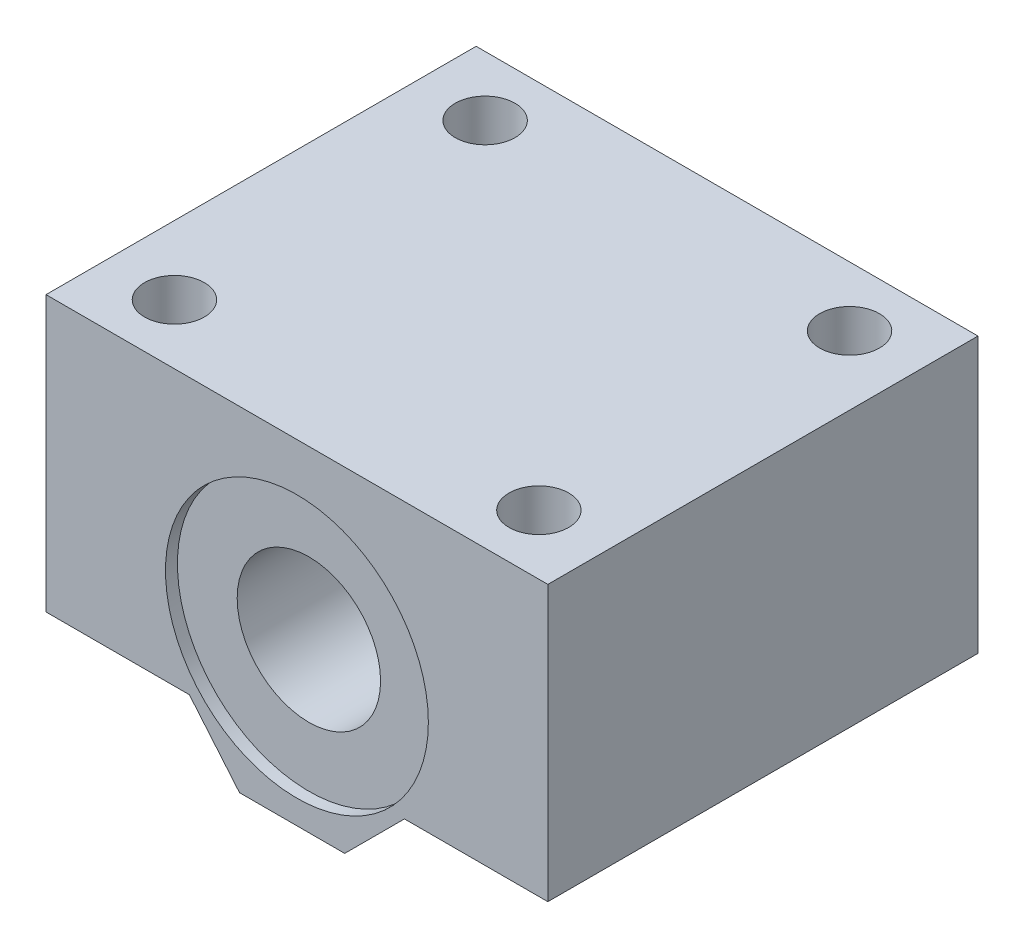
ISO-10303-21;
HEADER;
FILE_DESCRIPTION(('STEP AP214'),'2;1');
FILE_NAME('part.step','',(''),(''),'','','');
FILE_SCHEMA(('AUTOMOTIVE_DESIGN { 1 0 10303 214 1 1 1 1 }'));
ENDSEC;
DATA;
#1=APPLICATION_CONTEXT('core data for automotive mechanical design processes');
#2=APPLICATION_PROTOCOL_DEFINITION('international standard','automotive_design',2000,#1);
#3=PRODUCT_CONTEXT('',#1,'mechanical');
#4=PRODUCT('Part','Part','',(#3));
#5=PRODUCT_RELATED_PRODUCT_CATEGORY('part','',(#4));
#6=PRODUCT_DEFINITION_FORMATION('','',#4);
#7=PRODUCT_DEFINITION_CONTEXT('part definition',#1,'design');
#8=PRODUCT_DEFINITION('design','',#6,#7);
#9=PRODUCT_DEFINITION_SHAPE('','',#8);
#10=(LENGTH_UNIT() NAMED_UNIT(*) SI_UNIT(.MILLI.,.METRE.));
#11=(NAMED_UNIT(*) PLANE_ANGLE_UNIT() SI_UNIT($,.RADIAN.));
#12=(NAMED_UNIT(*) SI_UNIT($,.STERADIAN.) SOLID_ANGLE_UNIT());
#13=UNCERTAINTY_MEASURE_WITH_UNIT(LENGTH_MEASURE(1.E-05),#10,'distance_accuracy_value','');
#14=(GEOMETRIC_REPRESENTATION_CONTEXT(3) GLOBAL_UNCERTAINTY_ASSIGNED_CONTEXT((#13)) GLOBAL_UNIT_ASSIGNED_CONTEXT((#10,
#11,#12)) REPRESENTATION_CONTEXT('',''));
#15=CARTESIAN_POINT('',(0.,0.,0.));
#16=DIRECTION('',(0.,0.,1.));
#17=DIRECTION('',(1.,0.,0.));
#18=AXIS2_PLACEMENT_3D('',#15,#16,#17);
#19=CARTESIAN_POINT('',(0.,-1.,18.));
#20=DIRECTION('',(0.,0.,-1.));
#21=DIRECTION('',(-1.,0.,0.));
#22=AXIS2_PLACEMENT_3D('',#19,#20,#21);
#23=CYLINDRICAL_SURFACE('',#22,6.);
#24=CARTESIAN_POINT('',(0.,-1.,17.));
#25=DIRECTION('',(0.,0.,1.));
#26=DIRECTION('',(1.,0.,0.));
#27=AXIS2_PLACEMENT_3D('',#24,#25,#26);
#28=CIRCLE('',#27,6.);
#29=CARTESIAN_POINT('',(6.00000000000001,-1.,17.));
#30=VERTEX_POINT('',#29);
#31=EDGE_CURVE('E175',#30,#30,#28,.T.);
#32=ORIENTED_EDGE('',*,*,#31,.T.);
#33=EDGE_LOOP('',(#32));
#34=FACE_BOUND('',#33,.T.);
#35=CARTESIAN_POINT('',(0.,-1.,-17.));
#36=DIRECTION('',(0.,0.,-1.));
#37=DIRECTION('',(-1.,0.,0.));
#38=AXIS2_PLACEMENT_3D('',#35,#36,#37);
#39=CIRCLE('',#38,6.);
#40=CARTESIAN_POINT('',(-6.,-1.,-17.));
#41=VERTEX_POINT('',#40);
#42=EDGE_CURVE('E40',#41,#41,#39,.T.);
#43=ORIENTED_EDGE('',*,*,#42,.T.);
#44=EDGE_LOOP('',(#43));
#45=FACE_BOUND('',#44,.T.);
#46=ADVANCED_FACE('F36',(#34,#45),#23,.F.);
#47=CARTESIAN_POINT('',(-21.,14.,18.));
#48=DIRECTION('',(0.,-1.,0.));
#49=DIRECTION('',(0.,0.,-1.));
#50=AXIS2_PLACEMENT_3D('',#47,#48,#49);
#51=PLANE('',#50);
#52=CARTESIAN_POINT('',(15.25,14.,-13.));
#53=DIRECTION('',(0.,-1.,0.));
#54=DIRECTION('',(0.,0.,-1.));
#55=AXIS2_PLACEMENT_3D('',#52,#53,#54);
#56=CIRCLE('',#55,2.5);
#57=CARTESIAN_POINT('',(15.25,14.,-15.5));
#58=VERTEX_POINT('',#57);
#59=EDGE_CURVE('E173',#58,#58,#56,.T.);
#60=ORIENTED_EDGE('',*,*,#59,.T.);
#61=EDGE_LOOP('',(#60));
#62=FACE_BOUND('',#61,.T.);
#63=CARTESIAN_POINT('',(-15.25,14.,13.));
#64=DIRECTION('',(0.,-1.,0.));
#65=DIRECTION('',(0.,0.,-1.));
#66=AXIS2_PLACEMENT_3D('',#63,#64,#65);
#67=CIRCLE('',#66,2.5);
#68=CARTESIAN_POINT('',(-15.25,14.,10.5));
#69=VERTEX_POINT('',#68);
#70=EDGE_CURVE('E164',#69,#69,#67,.T.);
#71=ORIENTED_EDGE('',*,*,#70,.T.);
#72=EDGE_LOOP('',(#71));
#73=FACE_BOUND('',#72,.T.);
#74=DIRECTION('',(-1.,0.,0.));
#75=VECTOR('',#74,1.);
#76=CARTESIAN_POINT('',(-21.,14.,-18.));
#77=LINE('',#76,#75);
#78=CARTESIAN_POINT('',(21.,14.,-18.));
#79=VERTEX_POINT('',#78);
#80=CARTESIAN_POINT('',(-21.,14.,-18.));
#81=VERTEX_POINT('',#80);
#82=EDGE_CURVE('E125',#79,#81,#77,.T.);
#83=ORIENTED_EDGE('',*,*,#82,.T.);
#84=DIRECTION('',(0.,0.,-1.));
#85=VECTOR('',#84,1.);
#86=CARTESIAN_POINT('',(-21.,14.,18.));
#87=LINE('',#86,#85);
#88=CARTESIAN_POINT('',(-21.,14.,18.));
#89=VERTEX_POINT('',#88);
#90=EDGE_CURVE('E45',#89,#81,#87,.T.);
#91=ORIENTED_EDGE('',*,*,#90,.F.);
#92=DIRECTION('',(-1.,0.,0.));
#93=VECTOR('',#92,1.);
#94=CARTESIAN_POINT('',(-21.,14.,18.));
#95=LINE('',#94,#93);
#96=CARTESIAN_POINT('',(21.,14.,18.));
#97=VERTEX_POINT('',#96);
#98=EDGE_CURVE('E227',#97,#89,#95,.T.);
#99=ORIENTED_EDGE('',*,*,#98,.F.);
#100=DIRECTION('',(0.,0.,-1.));
#101=VECTOR('',#100,1.);
#102=CARTESIAN_POINT('',(21.,14.,18.));
#103=LINE('',#102,#101);
#104=EDGE_CURVE('E11',#97,#79,#103,.T.);
#105=ORIENTED_EDGE('',*,*,#104,.T.);
#106=EDGE_LOOP('',(#83,#91,#99,#105));
#107=FACE_BOUND('',#106,.T.);
#108=CARTESIAN_POINT('',(15.25,14.,13.));
#109=DIRECTION('',(0.,-1.,0.));
#110=DIRECTION('',(0.,0.,-1.));
#111=AXIS2_PLACEMENT_3D('',#108,#109,#110);
#112=CIRCLE('',#111,2.5);
#113=CARTESIAN_POINT('',(15.25,14.,10.5));
#114=VERTEX_POINT('',#113);
#115=EDGE_CURVE('E169',#114,#114,#112,.T.);
#116=ORIENTED_EDGE('',*,*,#115,.T.);
#117=EDGE_LOOP('',(#116));
#118=FACE_BOUND('',#117,.T.);
#119=CARTESIAN_POINT('',(-15.25,14.,-13.));
#120=DIRECTION('',(0.,-1.,0.));
#121=DIRECTION('',(0.,0.,-1.));
#122=AXIS2_PLACEMENT_3D('',#119,#120,#121);
#123=CIRCLE('',#122,2.5);
#124=CARTESIAN_POINT('',(-15.25,14.,-15.5));
#125=VERTEX_POINT('',#124);
#126=EDGE_CURVE('E177',#125,#125,#123,.T.);
#127=ORIENTED_EDGE('',*,*,#126,.T.);
#128=EDGE_LOOP('',(#127));
#129=FACE_BOUND('',#128,.T.);
#130=ADVANCED_FACE('F248',(#62,#73,#107,#118,#129),#51,.F.);
#131=CARTESIAN_POINT('',(-21.,-9.00000000000001,-18.));
#132=DIRECTION('',(0.,1.,0.));
#133=DIRECTION('',(0.,0.,1.));
#134=AXIS2_PLACEMENT_3D('',#131,#132,#133);
#135=PLANE('',#134);
#136=CARTESIAN_POINT('',(-15.25,-9.00000000000001,13.));
#137=DIRECTION('',(0.,1.,0.));
#138=DIRECTION('',(0.,0.,1.));
#139=AXIS2_PLACEMENT_3D('',#136,#137,#138);
#140=CIRCLE('',#139,2.15);
#141=CARTESIAN_POINT('',(-15.25,-9.00000000000001,15.15));
#142=VERTEX_POINT('',#141);
#143=EDGE_CURVE('E144',#142,#142,#140,.F.);
#144=ORIENTED_EDGE('',*,*,#143,.F.);
#145=EDGE_LOOP('',(#144));
#146=FACE_BOUND('',#145,.T.);
#147=DIRECTION('',(-1.,0.,0.));
#148=VECTOR('',#147,1.);
#149=CARTESIAN_POINT('',(-21.,-9.00000000000001,18.));
#150=LINE('',#149,#148);
#151=CARTESIAN_POINT('',(-9.,-9.00000000000001,18.));
#152=VERTEX_POINT('',#151);
#153=CARTESIAN_POINT('',(-21.,-9.00000000000001,18.));
#154=VERTEX_POINT('',#153);
#155=EDGE_CURVE('E217',#152,#154,#150,.T.);
#156=ORIENTED_EDGE('',*,*,#155,.T.);
#157=DIRECTION('',(0.,0.,1.));
#158=VECTOR('',#157,1.);
#159=CARTESIAN_POINT('',(-21.,-9.00000000000001,-18.));
#160=LINE('',#159,#158);
#161=CARTESIAN_POINT('',(-21.,-9.00000000000001,-18.));
#162=VERTEX_POINT('',#161);
#163=EDGE_CURVE('E126',#162,#154,#160,.T.);
#164=ORIENTED_EDGE('',*,*,#163,.F.);
#165=DIRECTION('',(-1.,0.,0.));
#166=VECTOR('',#165,1.);
#167=CARTESIAN_POINT('',(-21.,-9.00000000000001,-18.));
#168=LINE('',#167,#166);
#169=CARTESIAN_POINT('',(-9.,-9.00000000000001,-18.));
#170=VERTEX_POINT('',#169);
#171=EDGE_CURVE('E216',#170,#162,#168,.T.);
#172=ORIENTED_EDGE('',*,*,#171,.F.);
#173=DIRECTION('',(0.,0.,1.));
#174=VECTOR('',#173,1.);
#175=CARTESIAN_POINT('',(-9.,-9.00000000000001,-18.));
#176=LINE('',#175,#174);
#177=EDGE_CURVE('E131',#170,#152,#176,.T.);
#178=ORIENTED_EDGE('',*,*,#177,.T.);
#179=EDGE_LOOP('',(#156,#164,#172,#178));
#180=FACE_BOUND('',#179,.T.);
#181=CARTESIAN_POINT('',(-15.25,-9.00000000000001,-13.));
#182=DIRECTION('',(0.,1.,0.));
#183=DIRECTION('',(0.,0.,1.));
#184=AXIS2_PLACEMENT_3D('',#181,#182,#183);
#185=CIRCLE('',#184,2.15);
#186=CARTESIAN_POINT('',(-15.25,-9.00000000000001,-10.85));
#187=VERTEX_POINT('',#186);
#188=EDGE_CURVE('E154',#187,#187,#185,.F.);
#189=ORIENTED_EDGE('',*,*,#188,.F.);
#190=EDGE_LOOP('',(#189));
#191=FACE_BOUND('',#190,.T.);
#192=ADVANCED_FACE('F251',(#146,#180,#191),#135,.F.);
#193=CARTESIAN_POINT('',(21.,-9.00000000000001,-18.));
#194=DIRECTION('',(0.,1.,0.));
#195=DIRECTION('',(-1.,0.,0.));
#196=AXIS2_PLACEMENT_3D('',#193,#194,#195);
#197=PLANE('',#196);
#198=CARTESIAN_POINT('',(15.25,-9.00000000000001,13.));
#199=DIRECTION('',(0.,1.,0.));
#200=DIRECTION('',(-1.,0.,0.));
#201=AXIS2_PLACEMENT_3D('',#198,#199,#200);
#202=CIRCLE('',#201,2.15);
#203=CARTESIAN_POINT('',(13.1,-9.00000000000001,13.));
#204=VERTEX_POINT('',#203);
#205=EDGE_CURVE('E148',#204,#204,#202,.F.);
#206=ORIENTED_EDGE('',*,*,#205,.F.);
#207=EDGE_LOOP('',(#206));
#208=FACE_BOUND('',#207,.T.);
#209=DIRECTION('',(-1.,0.,0.));
#210=VECTOR('',#209,1.);
#211=CARTESIAN_POINT('',(21.,-9.00000000000001,18.));
#212=LINE('',#211,#210);
#213=CARTESIAN_POINT('',(21.,-9.00000000000001,18.));
#214=VERTEX_POINT('',#213);
#215=CARTESIAN_POINT('',(9.00000000000001,-9.00000000000001,18.));
#216=VERTEX_POINT('',#215);
#217=EDGE_CURVE('E147',#214,#216,#212,.T.);
#218=ORIENTED_EDGE('',*,*,#217,.T.);
#219=DIRECTION('',(0.,0.,1.));
#220=VECTOR('',#219,1.);
#221=CARTESIAN_POINT('',(9.00000000000001,-9.00000000000001,-18.));
#222=LINE('',#221,#220);
#223=CARTESIAN_POINT('',(9.00000000000001,-9.00000000000001,-18.));
#224=VERTEX_POINT('',#223);
#225=EDGE_CURVE('E109',#224,#216,#222,.T.);
#226=ORIENTED_EDGE('',*,*,#225,.F.);
#227=DIRECTION('',(-1.,0.,0.));
#228=VECTOR('',#227,1.);
#229=CARTESIAN_POINT('',(21.,-9.00000000000001,-18.));
#230=LINE('',#229,#228);
#231=CARTESIAN_POINT('',(21.,-9.00000000000001,-18.));
#232=VERTEX_POINT('',#231);
#233=EDGE_CURVE('E102',#232,#224,#230,.T.);
#234=ORIENTED_EDGE('',*,*,#233,.F.);
#235=DIRECTION('',(0.,0.,1.));
#236=VECTOR('',#235,1.);
#237=CARTESIAN_POINT('',(21.,-9.00000000000001,-18.));
#238=LINE('',#237,#236);
#239=EDGE_CURVE('E107',#232,#214,#238,.T.);
#240=ORIENTED_EDGE('',*,*,#239,.T.);
#241=EDGE_LOOP('',(#218,#226,#234,#240));
#242=FACE_BOUND('',#241,.T.);
#243=CARTESIAN_POINT('',(15.25,-9.00000000000001,-13.));
#244=DIRECTION('',(0.,1.,0.));
#245=DIRECTION('',(-1.,0.,0.));
#246=AXIS2_PLACEMENT_3D('',#243,#244,#245);
#247=CIRCLE('',#246,2.15);
#248=CARTESIAN_POINT('',(13.1,-9.00000000000001,-13.));
#249=VERTEX_POINT('',#248);
#250=EDGE_CURVE('E151',#249,#249,#247,.F.);
#251=ORIENTED_EDGE('',*,*,#250,.F.);
#252=EDGE_LOOP('',(#251));
#253=FACE_BOUND('',#252,.T.);
#254=ADVANCED_FACE('F105',(#208,#242,#253),#197,.F.);
#255=CARTESIAN_POINT('',(0.,0.,18.));
#256=DIRECTION('',(0.,0.,-1.));
#257=DIRECTION('',(-1.,0.,0.));
#258=AXIS2_PLACEMENT_3D('',#255,#256,#257);
#259=PLANE('',#258);
#260=CARTESIAN_POINT('',(0.,-1.,18.));
#261=DIRECTION('',(0.,0.,1.));
#262=DIRECTION('',(1.,0.,0.));
#263=AXIS2_PLACEMENT_3D('',#260,#261,#262);
#264=CIRCLE('',#263,11.);
#265=CARTESIAN_POINT('',(11.,-1.,18.));
#266=VERTEX_POINT('',#265);
#267=EDGE_CURVE('E184',#266,#266,#264,.T.);
#268=ORIENTED_EDGE('',*,*,#267,.F.);
#269=EDGE_LOOP('',(#268));
#270=FACE_BOUND('',#269,.T.);
#271=DIRECTION('',(1.,0.,0.));
#272=VECTOR('',#271,1.);
#273=CARTESIAN_POINT('',(-21.,-14.,18.));
#274=LINE('',#273,#272);
#275=CARTESIAN_POINT('',(-4.80450184411362,-14.,18.));
#276=VERTEX_POINT('',#275);
#277=CARTESIAN_POINT('',(4.00000000000002,-14.,18.));
#278=VERTEX_POINT('',#277);
#279=EDGE_CURVE('E134',#276,#278,#274,.T.);
#280=ORIENTED_EDGE('',*,*,#279,.T.);
#281=DIRECTION('',(-0.707106781186546,-0.707106781186549,0.));
#282=VECTOR('',#281,1.);
#283=CARTESIAN_POINT('',(9.00000000000001,-9.00000000000001,18.));
#284=LINE('',#283,#282);
#285=EDGE_CURVE('E53',#216,#278,#284,.T.);
#286=ORIENTED_EDGE('',*,*,#285,.F.);
#287=ORIENTED_EDGE('',*,*,#217,.F.);
#288=DIRECTION('',(0.,1.,0.));
#289=VECTOR('',#288,1.);
#290=CARTESIAN_POINT('',(21.,-14.,18.));
#291=LINE('',#290,#289);
#292=EDGE_CURVE('E121',#214,#97,#291,.T.);
#293=ORIENTED_EDGE('',*,*,#292,.T.);
#294=ORIENTED_EDGE('',*,*,#98,.T.);
#295=DIRECTION('',(0.,-1.,0.));
#296=VECTOR('',#295,1.);
#297=CARTESIAN_POINT('',(-21.,-14.,18.));
#298=LINE('',#297,#296);
#299=EDGE_CURVE('E228',#89,#154,#298,.T.);
#300=ORIENTED_EDGE('',*,*,#299,.T.);
#301=ORIENTED_EDGE('',*,*,#155,.F.);
#302=DIRECTION('',(-0.642787609686538,0.766044443118979,0.));
#303=VECTOR('',#302,1.);
#304=CARTESIAN_POINT('',(-9.,-9.00000000000001,18.));
#305=LINE('',#304,#303);
#306=EDGE_CURVE('E213',#276,#152,#305,.T.);
#307=ORIENTED_EDGE('',*,*,#306,.F.);
#308=EDGE_LOOP('',(#280,#286,#287,#293,#294,#300,#301,#307));
#309=FACE_BOUND('',#308,.T.);
#310=ADVANCED_FACE('F236',(#270,#309),#259,.F.);
#311=CARTESIAN_POINT('',(0.,0.,-18.));
#312=DIRECTION('',(0.,0.,-1.));
#313=DIRECTION('',(-1.,0.,0.));
#314=AXIS2_PLACEMENT_3D('',#311,#312,#313);
#315=PLANE('',#314);
#316=CARTESIAN_POINT('',(0.,-1.,-18.));
#317=DIRECTION('',(0.,0.,-1.));
#318=DIRECTION('',(-1.,0.,0.));
#319=AXIS2_PLACEMENT_3D('',#316,#317,#318);
#320=CIRCLE('',#319,11.);
#321=CARTESIAN_POINT('',(-11.,-1.,-18.));
#322=VERTEX_POINT('',#321);
#323=EDGE_CURVE('E191',#322,#322,#320,.T.);
#324=ORIENTED_EDGE('',*,*,#323,.F.);
#325=EDGE_LOOP('',(#324));
#326=FACE_BOUND('',#325,.T.);
#327=DIRECTION('',(-0.707106781186546,-0.707106781186549,0.));
#328=VECTOR('',#327,1.);
#329=CARTESIAN_POINT('',(9.00000000000001,-9.00000000000001,-18.));
#330=LINE('',#329,#328);
#331=CARTESIAN_POINT('',(4.00000000000003,-14.,-18.));
#332=VERTEX_POINT('',#331);
#333=EDGE_CURVE('E114',#224,#332,#330,.T.);
#334=ORIENTED_EDGE('',*,*,#333,.T.);
#335=DIRECTION('',(1.,0.,0.));
#336=VECTOR('',#335,1.);
#337=CARTESIAN_POINT('',(-21.,-14.,-18.));
#338=LINE('',#337,#336);
#339=CARTESIAN_POINT('',(-4.80450184411363,-14.,-18.));
#340=VERTEX_POINT('',#339);
#341=EDGE_CURVE('E139',#340,#332,#338,.T.);
#342=ORIENTED_EDGE('',*,*,#341,.F.);
#343=DIRECTION('',(-0.642787609686538,0.766044443118979,0.));
#344=VECTOR('',#343,1.);
#345=CARTESIAN_POINT('',(-9.,-9.00000000000001,-18.));
#346=LINE('',#345,#344);
#347=EDGE_CURVE('E61',#340,#170,#346,.T.);
#348=ORIENTED_EDGE('',*,*,#347,.T.);
#349=ORIENTED_EDGE('',*,*,#171,.T.);
#350=DIRECTION('',(0.,-1.,0.));
#351=VECTOR('',#350,1.);
#352=CARTESIAN_POINT('',(-21.,-14.,-18.));
#353=LINE('',#352,#351);
#354=EDGE_CURVE('E128',#81,#162,#353,.T.);
#355=ORIENTED_EDGE('',*,*,#354,.F.);
#356=ORIENTED_EDGE('',*,*,#82,.F.);
#357=DIRECTION('',(0.,1.,0.));
#358=VECTOR('',#357,1.);
#359=CARTESIAN_POINT('',(21.,-14.,-18.));
#360=LINE('',#359,#358);
#361=EDGE_CURVE('E119',#232,#79,#360,.T.);
#362=ORIENTED_EDGE('',*,*,#361,.F.);
#363=ORIENTED_EDGE('',*,*,#233,.T.);
#364=EDGE_LOOP('',(#334,#342,#348,#349,#355,#356,#362,#363));
#365=FACE_BOUND('',#364,.T.);
#366=ADVANCED_FACE('F123',(#326,#365),#315,.T.);
#367=CARTESIAN_POINT('',(21.,-14.,18.));
#368=DIRECTION('',(-1.,0.,0.));
#369=DIRECTION('',(0.,0.,1.));
#370=AXIS2_PLACEMENT_3D('',#367,#368,#369);
#371=PLANE('',#370);
#372=ORIENTED_EDGE('',*,*,#292,.F.);
#373=ORIENTED_EDGE('',*,*,#239,.F.);
#374=ORIENTED_EDGE('',*,*,#361,.T.);
#375=ORIENTED_EDGE('',*,*,#104,.F.);
#376=EDGE_LOOP('',(#372,#373,#374,#375));
#377=FACE_BOUND('',#376,.T.);
#378=ADVANCED_FACE('F38',(#377),#371,.F.);
#379=CARTESIAN_POINT('',(-21.,-14.,18.));
#380=DIRECTION('',(1.,0.,0.));
#381=DIRECTION('',(0.,0.,-1.));
#382=AXIS2_PLACEMENT_3D('',#379,#380,#381);
#383=PLANE('',#382);
#384=ORIENTED_EDGE('',*,*,#354,.T.);
#385=ORIENTED_EDGE('',*,*,#163,.T.);
#386=ORIENTED_EDGE('',*,*,#299,.F.);
#387=ORIENTED_EDGE('',*,*,#90,.T.);
#388=EDGE_LOOP('',(#384,#385,#386,#387));
#389=FACE_BOUND('',#388,.T.);
#390=ADVANCED_FACE('F244',(#389),#383,.F.);
#391=CARTESIAN_POINT('',(-21.,-14.,18.));
#392=DIRECTION('',(0.,1.,0.));
#393=DIRECTION('',(0.,0.,1.));
#394=AXIS2_PLACEMENT_3D('',#391,#392,#393);
#395=PLANE('',#394);
#396=ORIENTED_EDGE('',*,*,#341,.T.);
#397=DIRECTION('',(0.,0.,1.));
#398=VECTOR('',#397,1.);
#399=CARTESIAN_POINT('',(4.00000000000003,-14.,-18.));
#400=LINE('',#399,#398);
#401=EDGE_CURVE('E211',#332,#278,#400,.T.);
#402=ORIENTED_EDGE('',*,*,#401,.T.);
#403=ORIENTED_EDGE('',*,*,#279,.F.);
#404=DIRECTION('',(0.,0.,1.));
#405=VECTOR('',#404,1.);
#406=CARTESIAN_POINT('',(-4.80450184411362,-14.,-18.));
#407=LINE('',#406,#405);
#408=EDGE_CURVE('E220',#340,#276,#407,.T.);
#409=ORIENTED_EDGE('',*,*,#408,.F.);
#410=EDGE_LOOP('',(#396,#402,#403,#409));
#411=FACE_BOUND('',#410,.T.);
#412=ADVANCED_FACE('F238',(#411),#395,.F.);
#413=CARTESIAN_POINT('',(-9.,-9.00000000000001,-18.));
#414=DIRECTION('',(0.766044443118979,0.642787609686538,0.));
#415=DIRECTION('',(-0.642787609686538,0.766044443118979,0.));
#416=AXIS2_PLACEMENT_3D('',#413,#414,#415);
#417=PLANE('',#416);
#418=ORIENTED_EDGE('',*,*,#306,.T.);
#419=ORIENTED_EDGE('',*,*,#177,.F.);
#420=ORIENTED_EDGE('',*,*,#347,.F.);
#421=ORIENTED_EDGE('',*,*,#408,.T.);
#422=EDGE_LOOP('',(#418,#419,#420,#421));
#423=FACE_BOUND('',#422,.T.);
#424=ADVANCED_FACE('F280',(#423),#417,.F.);
#425=CARTESIAN_POINT('',(9.00000000000001,-9.00000000000001,-18.));
#426=DIRECTION('',(-0.707106781186549,0.707106781186546,0.));
#427=DIRECTION('',(-0.707106781186546,-0.707106781186549,0.));
#428=AXIS2_PLACEMENT_3D('',#425,#426,#427);
#429=PLANE('',#428);
#430=ORIENTED_EDGE('',*,*,#285,.T.);
#431=ORIENTED_EDGE('',*,*,#401,.F.);
#432=ORIENTED_EDGE('',*,*,#333,.F.);
#433=ORIENTED_EDGE('',*,*,#225,.T.);
#434=EDGE_LOOP('',(#430,#431,#432,#433));
#435=FACE_BOUND('',#434,.T.);
#436=ADVANCED_FACE('F240',(#435),#429,.F.);
#437=CARTESIAN_POINT('',(-15.25,-14.,13.));
#438=DIRECTION('',(0.,1.,0.));
#439=DIRECTION('',(0.,0.,1.));
#440=AXIS2_PLACEMENT_3D('',#437,#438,#439);
#441=CYLINDRICAL_SURFACE('',#440,2.15);
#442=CARTESIAN_POINT('',(-15.25,2.,13.));
#443=DIRECTION('',(0.,-1.,0.));
#444=DIRECTION('',(0.,0.,-1.));
#445=AXIS2_PLACEMENT_3D('',#442,#443,#444);
#446=CIRCLE('',#445,2.15);
#447=CARTESIAN_POINT('',(-15.25,2.,10.85));
#448=VERTEX_POINT('',#447);
#449=EDGE_CURVE('E157',#448,#448,#446,.T.);
#450=ORIENTED_EDGE('',*,*,#449,.F.);
#451=EDGE_LOOP('',(#450));
#452=FACE_BOUND('',#451,.T.);
#453=ORIENTED_EDGE('',*,*,#143,.T.);
#454=EDGE_LOOP('',(#453));
#455=FACE_BOUND('',#454,.T.);
#456=ADVANCED_FACE('F332',(#452,#455),#441,.F.);
#457=CARTESIAN_POINT('',(15.25,-14.,13.));
#458=DIRECTION('',(0.,1.,0.));
#459=DIRECTION('',(0.,0.,1.));
#460=AXIS2_PLACEMENT_3D('',#457,#458,#459);
#461=CYLINDRICAL_SURFACE('',#460,2.15);
#462=CARTESIAN_POINT('',(15.25,2.,13.));
#463=DIRECTION('',(0.,-1.,0.));
#464=DIRECTION('',(0.,0.,-1.));
#465=AXIS2_PLACEMENT_3D('',#462,#463,#464);
#466=CIRCLE('',#465,2.15);
#467=CARTESIAN_POINT('',(15.25,2.,10.85));
#468=VERTEX_POINT('',#467);
#469=EDGE_CURVE('E161',#468,#468,#466,.T.);
#470=ORIENTED_EDGE('',*,*,#469,.F.);
#471=EDGE_LOOP('',(#470));
#472=FACE_BOUND('',#471,.T.);
#473=ORIENTED_EDGE('',*,*,#205,.T.);
#474=EDGE_LOOP('',(#473));
#475=FACE_BOUND('',#474,.T.);
#476=ADVANCED_FACE('F337',(#472,#475),#461,.F.);
#477=CARTESIAN_POINT('',(15.25,-14.,-13.));
#478=DIRECTION('',(0.,1.,0.));
#479=DIRECTION('',(0.,0.,1.));
#480=AXIS2_PLACEMENT_3D('',#477,#478,#479);
#481=CYLINDRICAL_SURFACE('',#480,2.15);
#482=CARTESIAN_POINT('',(15.25,2.,-13.));
#483=DIRECTION('',(0.,-1.,0.));
#484=DIRECTION('',(0.,0.,-1.));
#485=AXIS2_PLACEMENT_3D('',#482,#483,#484);
#486=CIRCLE('',#485,2.15);
#487=CARTESIAN_POINT('',(15.25,2.,-15.15));
#488=VERTEX_POINT('',#487);
#489=EDGE_CURVE('E166',#488,#488,#486,.T.);
#490=ORIENTED_EDGE('',*,*,#489,.F.);
#491=EDGE_LOOP('',(#490));
#492=FACE_BOUND('',#491,.T.);
#493=ORIENTED_EDGE('',*,*,#250,.T.);
#494=EDGE_LOOP('',(#493));
#495=FACE_BOUND('',#494,.T.);
#496=ADVANCED_FACE('F348',(#492,#495),#481,.F.);
#497=CARTESIAN_POINT('',(-15.25,-14.,-13.));
#498=DIRECTION('',(0.,1.,0.));
#499=DIRECTION('',(0.,0.,1.));
#500=AXIS2_PLACEMENT_3D('',#497,#498,#499);
#501=CYLINDRICAL_SURFACE('',#500,2.15);
#502=CARTESIAN_POINT('',(-15.25,2.,-13.));
#503=DIRECTION('',(0.,-1.,0.));
#504=DIRECTION('',(0.,0.,-1.));
#505=AXIS2_PLACEMENT_3D('',#502,#503,#504);
#506=CIRCLE('',#505,2.15);
#507=CARTESIAN_POINT('',(-15.25,2.,-15.15));
#508=VERTEX_POINT('',#507);
#509=EDGE_CURVE('E171',#508,#508,#506,.T.);
#510=ORIENTED_EDGE('',*,*,#509,.F.);
#511=EDGE_LOOP('',(#510));
#512=FACE_BOUND('',#511,.T.);
#513=ORIENTED_EDGE('',*,*,#188,.T.);
#514=EDGE_LOOP('',(#513));
#515=FACE_BOUND('',#514,.T.);
#516=ADVANCED_FACE('F358',(#512,#515),#501,.F.);
#517=CARTESIAN_POINT('',(-15.25,2.,13.));
#518=DIRECTION('',(0.,1.,0.));
#519=DIRECTION('',(0.,0.,1.));
#520=AXIS2_PLACEMENT_3D('',#517,#518,#519);
#521=CYLINDRICAL_SURFACE('',#520,2.5);
#522=CARTESIAN_POINT('',(-15.25,2.,13.));
#523=DIRECTION('',(0.,-1.,0.));
#524=DIRECTION('',(0.,0.,-1.));
#525=AXIS2_PLACEMENT_3D('',#522,#523,#524);
#526=CIRCLE('',#525,2.5);
#527=CARTESIAN_POINT('',(-15.25,2.,10.5));
#528=VERTEX_POINT('',#527);
#529=EDGE_CURVE('E160',#528,#528,#526,.T.);
#530=ORIENTED_EDGE('',*,*,#529,.T.);
#531=EDGE_LOOP('',(#530));
#532=FACE_BOUND('',#531,.T.);
#533=ORIENTED_EDGE('',*,*,#70,.F.);
#534=EDGE_LOOP('',(#533));
#535=FACE_BOUND('',#534,.T.);
#536=ADVANCED_FACE('F367',(#532,#535),#521,.F.);
#537=CARTESIAN_POINT('',(-15.25,2.,13.));
#538=DIRECTION('',(0.,-1.,0.));
#539=DIRECTION('',(0.,0.,-1.));
#540=AXIS2_PLACEMENT_3D('',#537,#538,#539);
#541=PLANE('',#540);
#542=ORIENTED_EDGE('',*,*,#449,.T.);
#543=EDGE_LOOP('',(#542));
#544=FACE_BOUND('',#543,.T.);
#545=ORIENTED_EDGE('',*,*,#529,.F.);
#546=EDGE_LOOP('',(#545));
#547=FACE_BOUND('',#546,.T.);
#548=ADVANCED_FACE('F376',(#544,#547),#541,.F.);
#549=CARTESIAN_POINT('',(15.25,2.,13.));
#550=DIRECTION('',(0.,1.,0.));
#551=DIRECTION('',(0.,0.,1.));
#552=AXIS2_PLACEMENT_3D('',#549,#550,#551);
#553=CYLINDRICAL_SURFACE('',#552,2.5);
#554=CARTESIAN_POINT('',(15.25,2.,13.));
#555=DIRECTION('',(0.,-1.,0.));
#556=DIRECTION('',(0.,0.,-1.));
#557=AXIS2_PLACEMENT_3D('',#554,#555,#556);
#558=CIRCLE('',#557,2.5);
#559=CARTESIAN_POINT('',(15.25,2.,10.5));
#560=VERTEX_POINT('',#559);
#561=EDGE_CURVE('E165',#560,#560,#558,.T.);
#562=ORIENTED_EDGE('',*,*,#561,.T.);
#563=EDGE_LOOP('',(#562));
#564=FACE_BOUND('',#563,.T.);
#565=ORIENTED_EDGE('',*,*,#115,.F.);
#566=EDGE_LOOP('',(#565));
#567=FACE_BOUND('',#566,.T.);
#568=ADVANCED_FACE('F386',(#564,#567),#553,.F.);
#569=CARTESIAN_POINT('',(15.25,2.,13.));
#570=DIRECTION('',(0.,-1.,0.));
#571=DIRECTION('',(0.,0.,-1.));
#572=AXIS2_PLACEMENT_3D('',#569,#570,#571);
#573=PLANE('',#572);
#574=ORIENTED_EDGE('',*,*,#469,.T.);
#575=EDGE_LOOP('',(#574));
#576=FACE_BOUND('',#575,.T.);
#577=ORIENTED_EDGE('',*,*,#561,.F.);
#578=EDGE_LOOP('',(#577));
#579=FACE_BOUND('',#578,.T.);
#580=ADVANCED_FACE('F396',(#576,#579),#573,.F.);
#581=CARTESIAN_POINT('',(15.25,2.,-13.));
#582=DIRECTION('',(0.,1.,0.));
#583=DIRECTION('',(0.,0.,1.));
#584=AXIS2_PLACEMENT_3D('',#581,#582,#583);
#585=CYLINDRICAL_SURFACE('',#584,2.5);
#586=CARTESIAN_POINT('',(15.25,2.,-13.));
#587=DIRECTION('',(0.,-1.,0.));
#588=DIRECTION('',(0.,0.,-1.));
#589=AXIS2_PLACEMENT_3D('',#586,#587,#588);
#590=CIRCLE('',#589,2.5);
#591=CARTESIAN_POINT('',(15.25,2.,-15.5));
#592=VERTEX_POINT('',#591);
#593=EDGE_CURVE('E170',#592,#592,#590,.T.);
#594=ORIENTED_EDGE('',*,*,#593,.T.);
#595=EDGE_LOOP('',(#594));
#596=FACE_BOUND('',#595,.T.);
#597=ORIENTED_EDGE('',*,*,#59,.F.);
#598=EDGE_LOOP('',(#597));
#599=FACE_BOUND('',#598,.T.);
#600=ADVANCED_FACE('F270',(#596,#599),#585,.F.);
#601=CARTESIAN_POINT('',(15.25,2.,-13.));
#602=DIRECTION('',(0.,-1.,0.));
#603=DIRECTION('',(0.,0.,-1.));
#604=AXIS2_PLACEMENT_3D('',#601,#602,#603);
#605=PLANE('',#604);
#606=ORIENTED_EDGE('',*,*,#489,.T.);
#607=EDGE_LOOP('',(#606));
#608=FACE_BOUND('',#607,.T.);
#609=ORIENTED_EDGE('',*,*,#593,.F.);
#610=EDGE_LOOP('',(#609));
#611=FACE_BOUND('',#610,.T.);
#612=ADVANCED_FACE('F260',(#608,#611),#605,.F.);
#613=CARTESIAN_POINT('',(-15.25,2.,-13.));
#614=DIRECTION('',(0.,1.,0.));
#615=DIRECTION('',(0.,0.,1.));
#616=AXIS2_PLACEMENT_3D('',#613,#614,#615);
#617=CYLINDRICAL_SURFACE('',#616,2.5);
#618=CARTESIAN_POINT('',(-15.25,2.,-13.));
#619=DIRECTION('',(0.,-1.,0.));
#620=DIRECTION('',(0.,0.,-1.));
#621=AXIS2_PLACEMENT_3D('',#618,#619,#620);
#622=CIRCLE('',#621,2.5);
#623=CARTESIAN_POINT('',(-15.25,2.,-15.5));
#624=VERTEX_POINT('',#623);
#625=EDGE_CURVE('E174',#624,#624,#622,.T.);
#626=ORIENTED_EDGE('',*,*,#625,.T.);
#627=EDGE_LOOP('',(#626));
#628=FACE_BOUND('',#627,.T.);
#629=ORIENTED_EDGE('',*,*,#126,.F.);
#630=EDGE_LOOP('',(#629));
#631=FACE_BOUND('',#630,.T.);
#632=ADVANCED_FACE('F257',(#628,#631),#617,.F.);
#633=CARTESIAN_POINT('',(-15.25,2.,-13.));
#634=DIRECTION('',(0.,-1.,0.));
#635=DIRECTION('',(0.,0.,-1.));
#636=AXIS2_PLACEMENT_3D('',#633,#634,#635);
#637=PLANE('',#636);
#638=ORIENTED_EDGE('',*,*,#509,.T.);
#639=EDGE_LOOP('',(#638));
#640=FACE_BOUND('',#639,.T.);
#641=ORIENTED_EDGE('',*,*,#625,.F.);
#642=EDGE_LOOP('',(#641));
#643=FACE_BOUND('',#642,.T.);
#644=ADVANCED_FACE('F259',(#640,#643),#637,.F.);
#645=CARTESIAN_POINT('',(0.,-1.,17.));
#646=DIRECTION('',(0.,0.,1.));
#647=DIRECTION('',(1.,0.,0.));
#648=AXIS2_PLACEMENT_3D('',#645,#646,#647);
#649=CYLINDRICAL_SURFACE('',#648,11.);
#650=CARTESIAN_POINT('',(0.,-1.,17.));
#651=DIRECTION('',(0.,0.,1.));
#652=DIRECTION('',(1.,0.,0.));
#653=AXIS2_PLACEMENT_3D('',#650,#651,#652);
#654=CIRCLE('',#653,11.);
#655=CARTESIAN_POINT('',(11.,-1.,17.));
#656=VERTEX_POINT('',#655);
#657=EDGE_CURVE('E178',#656,#656,#654,.T.);
#658=ORIENTED_EDGE('',*,*,#657,.F.);
#659=EDGE_LOOP('',(#658));
#660=FACE_BOUND('',#659,.T.);
#661=ORIENTED_EDGE('',*,*,#267,.T.);
#662=EDGE_LOOP('',(#661));
#663=FACE_BOUND('',#662,.T.);
#664=ADVANCED_FACE('F267',(#660,#663),#649,.F.);
#665=CARTESIAN_POINT('',(0.,-1.,17.));
#666=DIRECTION('',(0.,0.,1.));
#667=DIRECTION('',(1.,0.,0.));
#668=AXIS2_PLACEMENT_3D('',#665,#666,#667);
#669=PLANE('',#668);
#670=ORIENTED_EDGE('',*,*,#31,.F.);
#671=EDGE_LOOP('',(#670));
#672=FACE_BOUND('',#671,.T.);
#673=ORIENTED_EDGE('',*,*,#657,.T.);
#674=EDGE_LOOP('',(#673));
#675=FACE_BOUND('',#674,.T.);
#676=ADVANCED_FACE('F438',(#672,#675),#669,.T.);
#677=CARTESIAN_POINT('',(0.,-1.,-17.));
#678=DIRECTION('',(0.,0.,-1.));
#679=DIRECTION('',(-1.,0.,0.));
#680=AXIS2_PLACEMENT_3D('',#677,#678,#679);
#681=CYLINDRICAL_SURFACE('',#680,11.);
#682=CARTESIAN_POINT('',(0.,-1.,-17.));
#683=DIRECTION('',(0.,0.,-1.));
#684=DIRECTION('',(-1.,0.,0.));
#685=AXIS2_PLACEMENT_3D('',#682,#683,#684);
#686=CIRCLE('',#685,11.);
#687=CARTESIAN_POINT('',(-11.,-1.,-17.));
#688=VERTEX_POINT('',#687);
#689=EDGE_CURVE('E484',#688,#688,#686,.T.);
#690=ORIENTED_EDGE('',*,*,#689,.F.);
#691=EDGE_LOOP('',(#690));
#692=FACE_BOUND('',#691,.T.);
#693=ORIENTED_EDGE('',*,*,#323,.T.);
#694=EDGE_LOOP('',(#693));
#695=FACE_BOUND('',#694,.T.);
#696=ADVANCED_FACE('F446',(#692,#695),#681,.F.);
#697=CARTESIAN_POINT('',(0.,-1.,-17.));
#698=DIRECTION('',(0.,0.,-1.));
#699=DIRECTION('',(-1.,0.,0.));
#700=AXIS2_PLACEMENT_3D('',#697,#698,#699);
#701=PLANE('',#700);
#702=ORIENTED_EDGE('',*,*,#42,.F.);
#703=EDGE_LOOP('',(#702));
#704=FACE_BOUND('',#703,.T.);
#705=ORIENTED_EDGE('',*,*,#689,.T.);
#706=EDGE_LOOP('',(#705));
#707=FACE_BOUND('',#706,.T.);
#708=ADVANCED_FACE('F453',(#704,#707),#701,.T.);
#709=CLOSED_SHELL('',(#46,#130,#192,#254,#310,#366,#378,#390,#412,#424,#436,#456,#476,#496,#516,
#536,#548,#568,#580,#600,#612,#632,#644,#664,#676,#696,#708));
#710=MANIFOLD_SOLID_BREP('B2',#709);
#711=ADVANCED_BREP_SHAPE_REPRESENTATION('',(#18,#710),#14);
#712=SHAPE_DEFINITION_REPRESENTATION(#9,#711);
ENDSEC;
END-ISO-10303-21;
